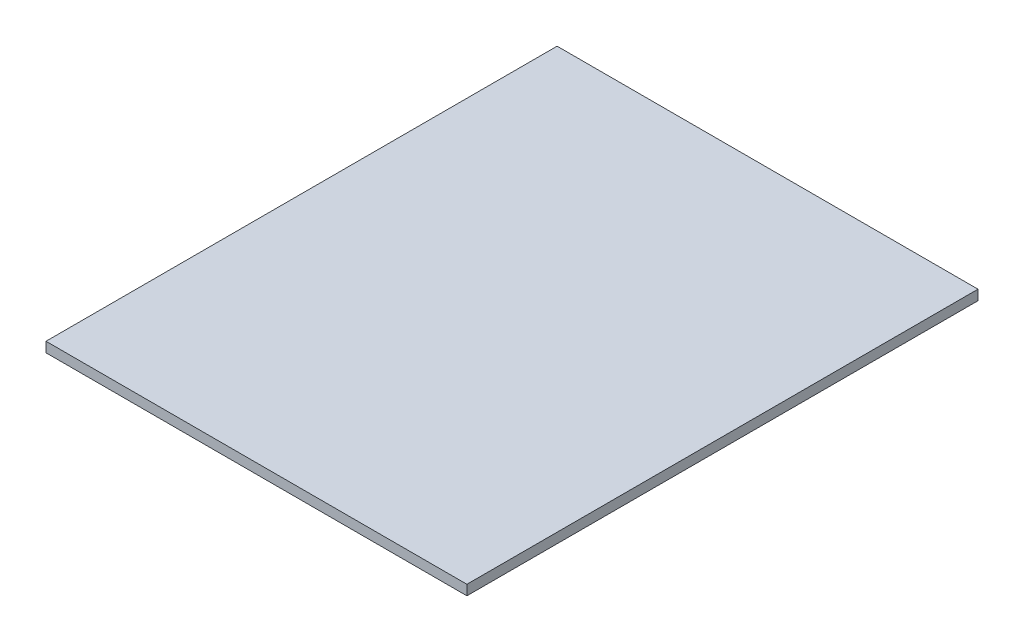
ISO-10303-21;
HEADER;
FILE_DESCRIPTION(('STEP AP214'),'2;1');
FILE_NAME('part.step','',(''),(''),'','','');
FILE_SCHEMA(('AUTOMOTIVE_DESIGN { 1 0 10303 214 1 1 1 1 }'));
ENDSEC;
DATA;
#1=APPLICATION_CONTEXT('core data for automotive mechanical design processes');
#2=APPLICATION_PROTOCOL_DEFINITION('international standard','automotive_design',2000,#1);
#3=PRODUCT_CONTEXT('',#1,'mechanical');
#4=PRODUCT('Part','Part','',(#3));
#5=PRODUCT_RELATED_PRODUCT_CATEGORY('part','',(#4));
#6=PRODUCT_DEFINITION_FORMATION('','',#4);
#7=PRODUCT_DEFINITION_CONTEXT('part definition',#1,'design');
#8=PRODUCT_DEFINITION('design','',#6,#7);
#9=PRODUCT_DEFINITION_SHAPE('','',#8);
#10=(LENGTH_UNIT() NAMED_UNIT(*) SI_UNIT(.MILLI.,.METRE.));
#11=(NAMED_UNIT(*) PLANE_ANGLE_UNIT() SI_UNIT($,.RADIAN.));
#12=(NAMED_UNIT(*) SI_UNIT($,.STERADIAN.) SOLID_ANGLE_UNIT());
#13=UNCERTAINTY_MEASURE_WITH_UNIT(LENGTH_MEASURE(1.E-05),#10,'distance_accuracy_value','');
#14=(GEOMETRIC_REPRESENTATION_CONTEXT(3) GLOBAL_UNCERTAINTY_ASSIGNED_CONTEXT((#13)) GLOBAL_UNIT_ASSIGNED_CONTEXT((#10,
#11,#12)) REPRESENTATION_CONTEXT('',''));
#15=CARTESIAN_POINT('',(0.,0.,0.));
#16=DIRECTION('',(0.,0.,1.));
#17=DIRECTION('',(1.,0.,0.));
#18=AXIS2_PLACEMENT_3D('',#15,#16,#17);
#19=CARTESIAN_POINT('',(210.,10.,-255.));
#20=DIRECTION('',(-1.,0.,0.));
#21=DIRECTION('',(0.,0.,1.));
#22=AXIS2_PLACEMENT_3D('',#19,#20,#21);
#23=PLANE('',#22);
#24=DIRECTION('',(0.,0.,-1.));
#25=VECTOR('',#24,1.);
#26=CARTESIAN_POINT('',(210.,0.,-255.));
#27=LINE('',#26,#25);
#28=CARTESIAN_POINT('',(210.,0.,255.));
#29=VERTEX_POINT('',#28);
#30=CARTESIAN_POINT('',(210.,0.,-255.));
#31=VERTEX_POINT('',#30);
#32=EDGE_CURVE('E96',#29,#31,#27,.T.);
#33=ORIENTED_EDGE('',*,*,#32,.T.);
#34=DIRECTION('',(0.,-1.,0.));
#35=VECTOR('',#34,1.);
#36=CARTESIAN_POINT('',(210.,10.,-255.));
#37=LINE('',#36,#35);
#38=CARTESIAN_POINT('',(210.,10.,-255.));
#39=VERTEX_POINT('',#38);
#40=EDGE_CURVE('E11',#39,#31,#37,.T.);
#41=ORIENTED_EDGE('',*,*,#40,.F.);
#42=DIRECTION('',(0.,0.,-1.));
#43=VECTOR('',#42,1.);
#44=CARTESIAN_POINT('',(210.,10.,-255.));
#45=LINE('',#44,#43);
#46=CARTESIAN_POINT('',(210.,10.,255.));
#47=VERTEX_POINT('',#46);
#48=EDGE_CURVE('E84',#47,#39,#45,.T.);
#49=ORIENTED_EDGE('',*,*,#48,.F.);
#50=DIRECTION('',(0.,-1.,0.));
#51=VECTOR('',#50,1.);
#52=CARTESIAN_POINT('',(210.,10.,255.));
#53=LINE('',#52,#51);
#54=EDGE_CURVE('E92',#47,#29,#53,.T.);
#55=ORIENTED_EDGE('',*,*,#54,.T.);
#56=EDGE_LOOP('',(#33,#41,#49,#55));
#57=FACE_BOUND('',#56,.T.);
#58=ADVANCED_FACE('F33',(#57),#23,.F.);
#59=CARTESIAN_POINT('',(-210.,10.,-255.));
#60=DIRECTION('',(0.,0.,1.));
#61=DIRECTION('',(1.,0.,0.));
#62=AXIS2_PLACEMENT_3D('',#59,#60,#61);
#63=PLANE('',#62);
#64=DIRECTION('',(-1.,0.,0.));
#65=VECTOR('',#64,1.);
#66=CARTESIAN_POINT('',(-210.,0.,-255.));
#67=LINE('',#66,#65);
#68=CARTESIAN_POINT('',(-210.,0.,-255.));
#69=VERTEX_POINT('',#68);
#70=EDGE_CURVE('E88',#31,#69,#67,.T.);
#71=ORIENTED_EDGE('',*,*,#70,.T.);
#72=DIRECTION('',(0.,-1.,0.));
#73=VECTOR('',#72,1.);
#74=CARTESIAN_POINT('',(-210.,10.,-255.));
#75=LINE('',#74,#73);
#76=CARTESIAN_POINT('',(-210.,10.,-255.));
#77=VERTEX_POINT('',#76);
#78=EDGE_CURVE('E41',#77,#69,#75,.T.);
#79=ORIENTED_EDGE('',*,*,#78,.F.);
#80=DIRECTION('',(-1.,0.,0.));
#81=VECTOR('',#80,1.);
#82=CARTESIAN_POINT('',(-210.,10.,-255.));
#83=LINE('',#82,#81);
#84=EDGE_CURVE('E79',#39,#77,#83,.T.);
#85=ORIENTED_EDGE('',*,*,#84,.F.);
#86=ORIENTED_EDGE('',*,*,#40,.T.);
#87=EDGE_LOOP('',(#71,#79,#85,#86));
#88=FACE_BOUND('',#87,.T.);
#89=ADVANCED_FACE('F87',(#88),#63,.F.);
#90=CARTESIAN_POINT('',(-210.,10.,-255.));
#91=DIRECTION('',(1.,0.,0.));
#92=DIRECTION('',(0.,0.,-1.));
#93=AXIS2_PLACEMENT_3D('',#90,#91,#92);
#94=PLANE('',#93);
#95=DIRECTION('',(0.,0.,1.));
#96=VECTOR('',#95,1.);
#97=CARTESIAN_POINT('',(-210.,0.,-255.));
#98=LINE('',#97,#96);
#99=CARTESIAN_POINT('',(-210.,0.,255.));
#100=VERTEX_POINT('',#99);
#101=EDGE_CURVE('E66',#69,#100,#98,.T.);
#102=ORIENTED_EDGE('',*,*,#101,.T.);
#103=DIRECTION('',(0.,-1.,0.));
#104=VECTOR('',#103,1.);
#105=CARTESIAN_POINT('',(-210.,10.,255.));
#106=LINE('',#105,#104);
#107=CARTESIAN_POINT('',(-210.,10.,255.));
#108=VERTEX_POINT('',#107);
#109=EDGE_CURVE('E89',#108,#100,#106,.T.);
#110=ORIENTED_EDGE('',*,*,#109,.F.);
#111=DIRECTION('',(0.,0.,1.));
#112=VECTOR('',#111,1.);
#113=CARTESIAN_POINT('',(-210.,10.,-255.));
#114=LINE('',#113,#112);
#115=EDGE_CURVE('E82',#77,#108,#114,.T.);
#116=ORIENTED_EDGE('',*,*,#115,.F.);
#117=ORIENTED_EDGE('',*,*,#78,.T.);
#118=EDGE_LOOP('',(#102,#110,#116,#117));
#119=FACE_BOUND('',#118,.T.);
#120=ADVANCED_FACE('F90',(#119),#94,.F.);
#121=CARTESIAN_POINT('',(-210.,10.,255.));
#122=DIRECTION('',(0.,0.,-1.));
#123=DIRECTION('',(-1.,0.,0.));
#124=AXIS2_PLACEMENT_3D('',#121,#122,#123);
#125=PLANE('',#124);
#126=DIRECTION('',(1.,0.,0.));
#127=VECTOR('',#126,1.);
#128=CARTESIAN_POINT('',(-210.,0.,255.));
#129=LINE('',#128,#127);
#130=EDGE_CURVE('E72',#100,#29,#129,.T.);
#131=ORIENTED_EDGE('',*,*,#130,.T.);
#132=ORIENTED_EDGE('',*,*,#54,.F.);
#133=DIRECTION('',(1.,0.,0.));
#134=VECTOR('',#133,1.);
#135=CARTESIAN_POINT('',(-210.,10.,255.));
#136=LINE('',#135,#134);
#137=EDGE_CURVE('E49',#108,#47,#136,.T.);
#138=ORIENTED_EDGE('',*,*,#137,.F.);
#139=ORIENTED_EDGE('',*,*,#109,.T.);
#140=EDGE_LOOP('',(#131,#132,#138,#139));
#141=FACE_BOUND('',#140,.T.);
#142=ADVANCED_FACE('F103',(#141),#125,.F.);
#143=CARTESIAN_POINT('',(0.,10.,0.));
#144=DIRECTION('',(0.,1.,0.));
#145=DIRECTION('',(0.,0.,1.));
#146=AXIS2_PLACEMENT_3D('',#143,#144,#145);
#147=PLANE('',#146);
#148=ORIENTED_EDGE('',*,*,#48,.T.);
#149=ORIENTED_EDGE('',*,*,#84,.T.);
#150=ORIENTED_EDGE('',*,*,#115,.T.);
#151=ORIENTED_EDGE('',*,*,#137,.T.);
#152=EDGE_LOOP('',(#148,#149,#150,#151));
#153=FACE_BOUND('',#152,.T.);
#154=ADVANCED_FACE('F80',(#153),#147,.T.);
#155=CARTESIAN_POINT('',(0.,0.,0.));
#156=DIRECTION('',(0.,1.,0.));
#157=DIRECTION('',(0.,0.,1.));
#158=AXIS2_PLACEMENT_3D('',#155,#156,#157);
#159=PLANE('',#158);
#160=ORIENTED_EDGE('',*,*,#32,.F.);
#161=ORIENTED_EDGE('',*,*,#130,.F.);
#162=ORIENTED_EDGE('',*,*,#101,.F.);
#163=ORIENTED_EDGE('',*,*,#70,.F.);
#164=EDGE_LOOP('',(#160,#161,#162,#163));
#165=FACE_BOUND('',#164,.T.);
#166=ADVANCED_FACE('F106',(#165),#159,.F.);
#167=CLOSED_SHELL('',(#58,#89,#120,#142,#154,#166));
#168=MANIFOLD_SOLID_BREP('B2',#167);
#169=ADVANCED_BREP_SHAPE_REPRESENTATION('',(#18,#168),#14);
#170=SHAPE_DEFINITION_REPRESENTATION(#9,#169);
ENDSEC;
END-ISO-10303-21;
